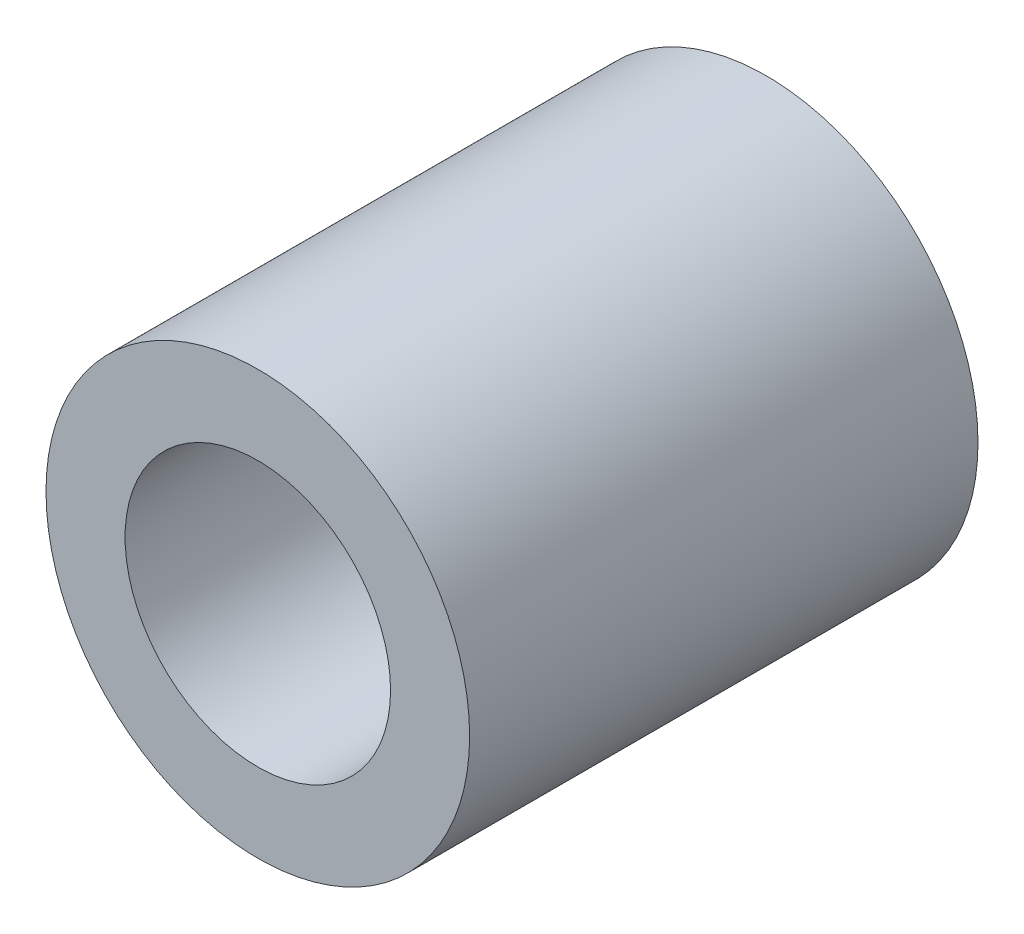
ISO-10303-21;
HEADER;
FILE_DESCRIPTION(('STEP AP214'),'2;1');
FILE_NAME('part.step','',(''),(''),'','','');
FILE_SCHEMA(('AUTOMOTIVE_DESIGN { 1 0 10303 214 1 1 1 1 }'));
ENDSEC;
DATA;
#1=APPLICATION_CONTEXT('core data for automotive mechanical design processes');
#2=APPLICATION_PROTOCOL_DEFINITION('international standard','automotive_design',2000,#1);
#3=PRODUCT_CONTEXT('',#1,'mechanical');
#4=PRODUCT('Part','Part','',(#3));
#5=PRODUCT_RELATED_PRODUCT_CATEGORY('part','',(#4));
#6=PRODUCT_DEFINITION_FORMATION('','',#4);
#7=PRODUCT_DEFINITION_CONTEXT('part definition',#1,'design');
#8=PRODUCT_DEFINITION('design','',#6,#7);
#9=PRODUCT_DEFINITION_SHAPE('','',#8);
#10=(LENGTH_UNIT() NAMED_UNIT(*) SI_UNIT(.MILLI.,.METRE.));
#11=(NAMED_UNIT(*) PLANE_ANGLE_UNIT() SI_UNIT($,.RADIAN.));
#12=(NAMED_UNIT(*) SI_UNIT($,.STERADIAN.) SOLID_ANGLE_UNIT());
#13=UNCERTAINTY_MEASURE_WITH_UNIT(LENGTH_MEASURE(1.E-05),#10,'distance_accuracy_value','');
#14=(GEOMETRIC_REPRESENTATION_CONTEXT(3) GLOBAL_UNCERTAINTY_ASSIGNED_CONTEXT((#13)) GLOBAL_UNIT_ASSIGNED_CONTEXT((#10,
#11,#12)) REPRESENTATION_CONTEXT('',''));
#15=CARTESIAN_POINT('',(0.,0.,0.));
#16=DIRECTION('',(0.,0.,1.));
#17=DIRECTION('',(1.,0.,0.));
#18=AXIS2_PLACEMENT_3D('',#15,#16,#17);
#19=CARTESIAN_POINT('',(0.,0.,11.43));
#20=DIRECTION('',(0.,0.,1.));
#21=DIRECTION('',(1.,0.,0.));
#22=AXIS2_PLACEMENT_3D('',#19,#20,#21);
#23=PLANE('',#22);
#24=CARTESIAN_POINT('',(0.,0.,11.43));
#25=DIRECTION('',(0.,0.,1.));
#26=DIRECTION('',(1.,0.,0.));
#27=AXIS2_PLACEMENT_3D('',#24,#25,#26);
#28=CIRCLE('',#27,4.7625);
#29=CARTESIAN_POINT('',(4.7625,0.,11.43));
#30=VERTEX_POINT('',#29);
#31=EDGE_CURVE('E10',#30,#30,#28,.T.);
#32=ORIENTED_EDGE('',*,*,#31,.T.);
#33=EDGE_LOOP('',(#32));
#34=FACE_BOUND('',#33,.T.);
#35=CARTESIAN_POINT('',(0.,0.,11.43));
#36=DIRECTION('',(0.,0.,1.));
#37=DIRECTION('',(1.,0.,0.));
#38=AXIS2_PLACEMENT_3D('',#35,#36,#37);
#39=CIRCLE('',#38,2.9845);
#40=CARTESIAN_POINT('',(2.9845,0.,11.43));
#41=VERTEX_POINT('',#40);
#42=EDGE_CURVE('E46',#41,#41,#39,.T.);
#43=ORIENTED_EDGE('',*,*,#42,.F.);
#44=EDGE_LOOP('',(#43));
#45=FACE_BOUND('',#44,.T.);
#46=ADVANCED_FACE('F35',(#34,#45),#23,.T.);
#47=CARTESIAN_POINT('',(0.,0.,0.));
#48=DIRECTION('',(0.,0.,1.));
#49=DIRECTION('',(1.,0.,0.));
#50=AXIS2_PLACEMENT_3D('',#47,#48,#49);
#51=PLANE('',#50);
#52=CARTESIAN_POINT('',(0.,0.,0.));
#53=DIRECTION('',(0.,0.,1.));
#54=DIRECTION('',(1.,0.,0.));
#55=AXIS2_PLACEMENT_3D('',#52,#53,#54);
#56=CIRCLE('',#55,4.7625);
#57=CARTESIAN_POINT('',(4.7625,0.,0.));
#58=VERTEX_POINT('',#57);
#59=EDGE_CURVE('E39',#58,#58,#56,.T.);
#60=ORIENTED_EDGE('',*,*,#59,.F.);
#61=EDGE_LOOP('',(#60));
#62=FACE_BOUND('',#61,.T.);
#63=CARTESIAN_POINT('',(0.,0.,0.));
#64=DIRECTION('',(0.,0.,1.));
#65=DIRECTION('',(1.,0.,0.));
#66=AXIS2_PLACEMENT_3D('',#63,#64,#65);
#67=CIRCLE('',#66,2.9845);
#68=CARTESIAN_POINT('',(2.9845,0.,0.));
#69=VERTEX_POINT('',#68);
#70=EDGE_CURVE('E48',#69,#69,#67,.T.);
#71=ORIENTED_EDGE('',*,*,#70,.T.);
#72=EDGE_LOOP('',(#71));
#73=FACE_BOUND('',#72,.T.);
#74=ADVANCED_FACE('F58',(#62,#73),#51,.F.);
#75=CARTESIAN_POINT('',(0.,0.,11.43));
#76=DIRECTION('',(0.,0.,-1.));
#77=DIRECTION('',(-1.,0.,0.));
#78=AXIS2_PLACEMENT_3D('',#75,#76,#77);
#79=CYLINDRICAL_SURFACE('',#78,4.7625);
#80=ORIENTED_EDGE('',*,*,#31,.F.);
#81=EDGE_LOOP('',(#80));
#82=FACE_BOUND('',#81,.T.);
#83=ORIENTED_EDGE('',*,*,#59,.T.);
#84=EDGE_LOOP('',(#83));
#85=FACE_BOUND('',#84,.T.);
#86=ADVANCED_FACE('F37',(#82,#85),#79,.T.);
#87=CARTESIAN_POINT('',(0.,0.,11.43));
#88=DIRECTION('',(0.,0.,-1.));
#89=DIRECTION('',(-1.,0.,0.));
#90=AXIS2_PLACEMENT_3D('',#87,#88,#89);
#91=CYLINDRICAL_SURFACE('',#90,2.9845);
#92=ORIENTED_EDGE('',*,*,#42,.T.);
#93=EDGE_LOOP('',(#92));
#94=FACE_BOUND('',#93,.T.);
#95=ORIENTED_EDGE('',*,*,#70,.F.);
#96=EDGE_LOOP('',(#95));
#97=FACE_BOUND('',#96,.T.);
#98=ADVANCED_FACE('F54',(#94,#97),#91,.F.);
#99=CLOSED_SHELL('',(#46,#74,#86,#98));
#100=MANIFOLD_SOLID_BREP('B2',#99);
#101=ADVANCED_BREP_SHAPE_REPRESENTATION('',(#18,#100),#14);
#102=SHAPE_DEFINITION_REPRESENTATION(#9,#101);
ENDSEC;
END-ISO-10303-21;
